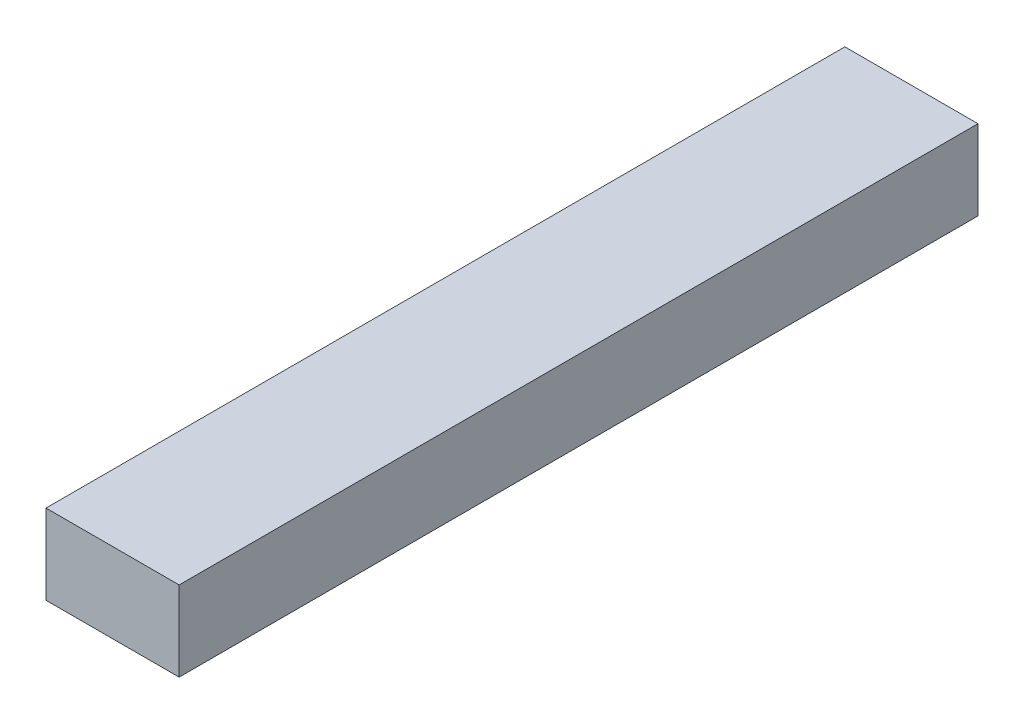
ISO-10303-21;
HEADER;
FILE_DESCRIPTION(('STEP AP214'),'2;1');
FILE_NAME('part.step','',(''),(''),'','','');
FILE_SCHEMA(('AUTOMOTIVE_DESIGN { 1 0 10303 214 1 1 1 1 }'));
ENDSEC;
DATA;
#1=APPLICATION_CONTEXT('core data for automotive mechanical design processes');
#2=APPLICATION_PROTOCOL_DEFINITION('international standard','automotive_design',2000,#1);
#3=PRODUCT_CONTEXT('',#1,'mechanical');
#4=PRODUCT('Part','Part','',(#3));
#5=PRODUCT_RELATED_PRODUCT_CATEGORY('part','',(#4));
#6=PRODUCT_DEFINITION_FORMATION('','',#4);
#7=PRODUCT_DEFINITION_CONTEXT('part definition',#1,'design');
#8=PRODUCT_DEFINITION('design','',#6,#7);
#9=PRODUCT_DEFINITION_SHAPE('','',#8);
#10=(LENGTH_UNIT() NAMED_UNIT(*) SI_UNIT(.MILLI.,.METRE.));
#11=(NAMED_UNIT(*) PLANE_ANGLE_UNIT() SI_UNIT($,.RADIAN.));
#12=(NAMED_UNIT(*) SI_UNIT($,.STERADIAN.) SOLID_ANGLE_UNIT());
#13=UNCERTAINTY_MEASURE_WITH_UNIT(LENGTH_MEASURE(1.E-05),#10,'distance_accuracy_value','');
#14=(GEOMETRIC_REPRESENTATION_CONTEXT(3) GLOBAL_UNCERTAINTY_ASSIGNED_CONTEXT((#13)) GLOBAL_UNIT_ASSIGNED_CONTEXT((#10,
#11,#12)) REPRESENTATION_CONTEXT('',''));
#15=CARTESIAN_POINT('',(0.,0.,0.));
#16=DIRECTION('',(0.,0.,1.));
#17=DIRECTION('',(1.,0.,0.));
#18=AXIS2_PLACEMENT_3D('',#15,#16,#17);
#19=CARTESIAN_POINT('',(0.,0.,300.));
#20=DIRECTION('',(-1.,0.,0.));
#21=DIRECTION('',(0.,0.,1.));
#22=AXIS2_PLACEMENT_3D('',#19,#20,#21);
#23=PLANE('',#22);
#24=DIRECTION('',(0.,1.,0.));
#25=VECTOR('',#24,1.);
#26=CARTESIAN_POINT('',(0.,0.,0.));
#27=LINE('',#26,#25);
#28=CARTESIAN_POINT('',(0.,0.,0.));
#29=VERTEX_POINT('',#28);
#30=CARTESIAN_POINT('',(0.,30.,0.));
#31=VERTEX_POINT('',#30);
#32=EDGE_CURVE('E96',#29,#31,#27,.T.);
#33=ORIENTED_EDGE('',*,*,#32,.T.);
#34=DIRECTION('',(0.,0.,-1.));
#35=VECTOR('',#34,1.);
#36=CARTESIAN_POINT('',(0.,30.,300.));
#37=LINE('',#36,#35);
#38=CARTESIAN_POINT('',(0.,30.,300.));
#39=VERTEX_POINT('',#38);
#40=EDGE_CURVE('E11',#39,#31,#37,.T.);
#41=ORIENTED_EDGE('',*,*,#40,.F.);
#42=DIRECTION('',(0.,1.,0.));
#43=VECTOR('',#42,1.);
#44=CARTESIAN_POINT('',(0.,0.,300.));
#45=LINE('',#44,#43);
#46=CARTESIAN_POINT('',(0.,0.,300.));
#47=VERTEX_POINT('',#46);
#48=EDGE_CURVE('E84',#47,#39,#45,.T.);
#49=ORIENTED_EDGE('',*,*,#48,.F.);
#50=DIRECTION('',(0.,0.,-1.));
#51=VECTOR('',#50,1.);
#52=CARTESIAN_POINT('',(0.,0.,300.));
#53=LINE('',#52,#51);
#54=EDGE_CURVE('E92',#47,#29,#53,.T.);
#55=ORIENTED_EDGE('',*,*,#54,.T.);
#56=EDGE_LOOP('',(#33,#41,#49,#55));
#57=FACE_BOUND('',#56,.T.);
#58=ADVANCED_FACE('F33',(#57),#23,.F.);
#59=CARTESIAN_POINT('',(0.,30.,300.));
#60=DIRECTION('',(0.,-1.,0.));
#61=DIRECTION('',(1.,0.,0.));
#62=AXIS2_PLACEMENT_3D('',#59,#60,#61);
#63=PLANE('',#62);
#64=DIRECTION('',(-1.,0.,0.));
#65=VECTOR('',#64,1.);
#66=CARTESIAN_POINT('',(0.,30.,0.));
#67=LINE('',#66,#65);
#68=CARTESIAN_POINT('',(-50.,30.,0.));
#69=VERTEX_POINT('',#68);
#70=EDGE_CURVE('E88',#31,#69,#67,.T.);
#71=ORIENTED_EDGE('',*,*,#70,.T.);
#72=DIRECTION('',(0.,0.,-1.));
#73=VECTOR('',#72,1.);
#74=CARTESIAN_POINT('',(-50.,30.,300.));
#75=LINE('',#74,#73);
#76=CARTESIAN_POINT('',(-50.,30.,300.));
#77=VERTEX_POINT('',#76);
#78=EDGE_CURVE('E41',#77,#69,#75,.T.);
#79=ORIENTED_EDGE('',*,*,#78,.F.);
#80=DIRECTION('',(-1.,0.,0.));
#81=VECTOR('',#80,1.);
#82=CARTESIAN_POINT('',(0.,30.,300.));
#83=LINE('',#82,#81);
#84=EDGE_CURVE('E79',#39,#77,#83,.T.);
#85=ORIENTED_EDGE('',*,*,#84,.F.);
#86=ORIENTED_EDGE('',*,*,#40,.T.);
#87=EDGE_LOOP('',(#71,#79,#85,#86));
#88=FACE_BOUND('',#87,.T.);
#89=ADVANCED_FACE('F87',(#88),#63,.F.);
#90=CARTESIAN_POINT('',(-50.,0.,300.));
#91=DIRECTION('',(1.,0.,0.));
#92=DIRECTION('',(0.,0.,-1.));
#93=AXIS2_PLACEMENT_3D('',#90,#91,#92);
#94=PLANE('',#93);
#95=DIRECTION('',(0.,-1.,0.));
#96=VECTOR('',#95,1.);
#97=CARTESIAN_POINT('',(-50.,0.,0.));
#98=LINE('',#97,#96);
#99=CARTESIAN_POINT('',(-50.,0.,0.));
#100=VERTEX_POINT('',#99);
#101=EDGE_CURVE('E66',#69,#100,#98,.T.);
#102=ORIENTED_EDGE('',*,*,#101,.T.);
#103=DIRECTION('',(0.,0.,-1.));
#104=VECTOR('',#103,1.);
#105=CARTESIAN_POINT('',(-50.,0.,300.));
#106=LINE('',#105,#104);
#107=CARTESIAN_POINT('',(-50.,0.,300.));
#108=VERTEX_POINT('',#107);
#109=EDGE_CURVE('E89',#108,#100,#106,.T.);
#110=ORIENTED_EDGE('',*,*,#109,.F.);
#111=DIRECTION('',(0.,-1.,0.));
#112=VECTOR('',#111,1.);
#113=CARTESIAN_POINT('',(-50.,0.,300.));
#114=LINE('',#113,#112);
#115=EDGE_CURVE('E82',#77,#108,#114,.T.);
#116=ORIENTED_EDGE('',*,*,#115,.F.);
#117=ORIENTED_EDGE('',*,*,#78,.T.);
#118=EDGE_LOOP('',(#102,#110,#116,#117));
#119=FACE_BOUND('',#118,.T.);
#120=ADVANCED_FACE('F90',(#119),#94,.F.);
#121=CARTESIAN_POINT('',(0.,0.,300.));
#122=DIRECTION('',(0.,1.,0.));
#123=DIRECTION('',(0.,0.,1.));
#124=AXIS2_PLACEMENT_3D('',#121,#122,#123);
#125=PLANE('',#124);
#126=DIRECTION('',(1.,0.,0.));
#127=VECTOR('',#126,1.);
#128=CARTESIAN_POINT('',(0.,0.,0.));
#129=LINE('',#128,#127);
#130=EDGE_CURVE('E72',#100,#29,#129,.T.);
#131=ORIENTED_EDGE('',*,*,#130,.T.);
#132=ORIENTED_EDGE('',*,*,#54,.F.);
#133=DIRECTION('',(1.,0.,0.));
#134=VECTOR('',#133,1.);
#135=CARTESIAN_POINT('',(0.,0.,300.));
#136=LINE('',#135,#134);
#137=EDGE_CURVE('E49',#108,#47,#136,.T.);
#138=ORIENTED_EDGE('',*,*,#137,.F.);
#139=ORIENTED_EDGE('',*,*,#109,.T.);
#140=EDGE_LOOP('',(#131,#132,#138,#139));
#141=FACE_BOUND('',#140,.T.);
#142=ADVANCED_FACE('F103',(#141),#125,.F.);
#143=CARTESIAN_POINT('',(0.,0.,300.));
#144=DIRECTION('',(0.,0.,1.));
#145=DIRECTION('',(1.,0.,0.));
#146=AXIS2_PLACEMENT_3D('',#143,#144,#145);
#147=PLANE('',#146);
#148=ORIENTED_EDGE('',*,*,#48,.T.);
#149=ORIENTED_EDGE('',*,*,#84,.T.);
#150=ORIENTED_EDGE('',*,*,#115,.T.);
#151=ORIENTED_EDGE('',*,*,#137,.T.);
#152=EDGE_LOOP('',(#148,#149,#150,#151));
#153=FACE_BOUND('',#152,.T.);
#154=ADVANCED_FACE('F80',(#153),#147,.T.);
#155=CARTESIAN_POINT('',(0.,0.,0.));
#156=DIRECTION('',(0.,0.,1.));
#157=DIRECTION('',(1.,0.,0.));
#158=AXIS2_PLACEMENT_3D('',#155,#156,#157);
#159=PLANE('',#158);
#160=ORIENTED_EDGE('',*,*,#32,.F.);
#161=ORIENTED_EDGE('',*,*,#130,.F.);
#162=ORIENTED_EDGE('',*,*,#101,.F.);
#163=ORIENTED_EDGE('',*,*,#70,.F.);
#164=EDGE_LOOP('',(#160,#161,#162,#163));
#165=FACE_BOUND('',#164,.T.);
#166=ADVANCED_FACE('F106',(#165),#159,.F.);
#167=CLOSED_SHELL('',(#58,#89,#120,#142,#154,#166));
#168=MANIFOLD_SOLID_BREP('B2',#167);
#169=ADVANCED_BREP_SHAPE_REPRESENTATION('',(#18,#168),#14);
#170=SHAPE_DEFINITION_REPRESENTATION(#9,#169);
ENDSEC;
END-ISO-10303-21;
